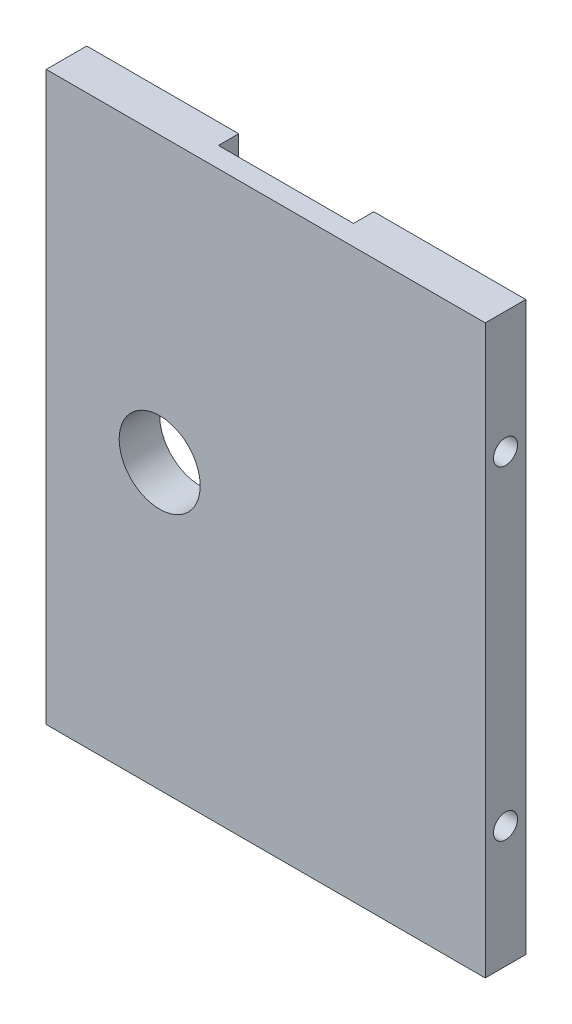
ISO-10303-21;
HEADER;
FILE_DESCRIPTION(('STEP AP214'),'2;1');
FILE_NAME('part.step','',(''),(''),'','','');
FILE_SCHEMA(('AUTOMOTIVE_DESIGN { 1 0 10303 214 1 1 1 1 }'));
ENDSEC;
DATA;
#1=APPLICATION_CONTEXT('core data for automotive mechanical design processes');
#2=APPLICATION_PROTOCOL_DEFINITION('international standard','automotive_design',2000,#1);
#3=PRODUCT_CONTEXT('',#1,'mechanical');
#4=PRODUCT('Part','Part','',(#3));
#5=PRODUCT_RELATED_PRODUCT_CATEGORY('part','',(#4));
#6=PRODUCT_DEFINITION_FORMATION('','',#4);
#7=PRODUCT_DEFINITION_CONTEXT('part definition',#1,'design');
#8=PRODUCT_DEFINITION('design','',#6,#7);
#9=PRODUCT_DEFINITION_SHAPE('','',#8);
#10=(LENGTH_UNIT() NAMED_UNIT(*) SI_UNIT(.MILLI.,.METRE.));
#11=(NAMED_UNIT(*) PLANE_ANGLE_UNIT() SI_UNIT($,.RADIAN.));
#12=(NAMED_UNIT(*) SI_UNIT($,.STERADIAN.) SOLID_ANGLE_UNIT());
#13=UNCERTAINTY_MEASURE_WITH_UNIT(LENGTH_MEASURE(1.E-05),#10,'distance_accuracy_value','');
#14=(GEOMETRIC_REPRESENTATION_CONTEXT(3) GLOBAL_UNCERTAINTY_ASSIGNED_CONTEXT((#13)) GLOBAL_UNIT_ASSIGNED_CONTEXT((#10,
#11,#12)) REPRESENTATION_CONTEXT('',''));
#15=CARTESIAN_POINT('',(0.,0.,0.));
#16=DIRECTION('',(0.,0.,1.));
#17=DIRECTION('',(1.,0.,0.));
#18=AXIS2_PLACEMENT_3D('',#15,#16,#17);
#19=CARTESIAN_POINT('',(0.,42.,3.));
#20=DIRECTION('',(0.,-1.,0.));
#21=DIRECTION('',(0.,0.,-1.));
#22=AXIS2_PLACEMENT_3D('',#19,#20,#21);
#23=PLANE('',#22);
#24=DIRECTION('',(0.,0.,-1.));
#25=VECTOR('',#24,1.);
#26=CARTESIAN_POINT('',(21.25,42.,1.5));
#27=LINE('',#26,#25);
#28=CARTESIAN_POINT('',(21.25,42.,1.5));
#29=VERTEX_POINT('',#28);
#30=CARTESIAN_POINT('',(21.25,42.,0.));
#31=VERTEX_POINT('',#30);
#32=EDGE_CURVE('E169',#29,#31,#27,.T.);
#33=ORIENTED_EDGE('',*,*,#32,.F.);
#34=DIRECTION('',(1.,0.,0.));
#35=VECTOR('',#34,1.);
#36=CARTESIAN_POINT('',(0.,42.,1.5));
#37=LINE('',#36,#35);
#38=CARTESIAN_POINT('',(11.25,42.,1.5));
#39=VERTEX_POINT('',#38);
#40=EDGE_CURVE('E148',#39,#29,#37,.T.);
#41=ORIENTED_EDGE('',*,*,#40,.F.);
#42=DIRECTION('',(0.,0.,-1.));
#43=VECTOR('',#42,1.);
#44=CARTESIAN_POINT('',(11.25,42.,1.5));
#45=LINE('',#44,#43);
#46=CARTESIAN_POINT('',(11.25,42.,0.));
#47=VERTEX_POINT('',#46);
#48=EDGE_CURVE('E173',#39,#47,#45,.T.);
#49=ORIENTED_EDGE('',*,*,#48,.T.);
#50=DIRECTION('',(-1.,0.,0.));
#51=VECTOR('',#50,1.);
#52=CARTESIAN_POINT('',(0.,42.,0.));
#53=LINE('',#52,#51);
#54=CARTESIAN_POINT('',(0.,42.,0.));
#55=VERTEX_POINT('',#54);
#56=EDGE_CURVE('E90',#47,#55,#53,.T.);
#57=ORIENTED_EDGE('',*,*,#56,.T.);
#58=DIRECTION('',(0.,0.,-1.));
#59=VECTOR('',#58,1.);
#60=CARTESIAN_POINT('',(0.,42.,3.));
#61=LINE('',#60,#59);
#62=CARTESIAN_POINT('',(0.,42.,3.));
#63=VERTEX_POINT('',#62);
#64=EDGE_CURVE('E229',#63,#55,#61,.T.);
#65=ORIENTED_EDGE('',*,*,#64,.F.);
#66=DIRECTION('',(-1.,0.,0.));
#67=VECTOR('',#66,1.);
#68=CARTESIAN_POINT('',(0.,42.,3.));
#69=LINE('',#68,#67);
#70=CARTESIAN_POINT('',(32.5,42.,3.));
#71=VERTEX_POINT('',#70);
#72=EDGE_CURVE('E69',#71,#63,#69,.T.);
#73=ORIENTED_EDGE('',*,*,#72,.F.);
#74=DIRECTION('',(0.,0.,-1.));
#75=VECTOR('',#74,1.);
#76=CARTESIAN_POINT('',(32.5,42.,3.));
#77=LINE('',#76,#75);
#78=CARTESIAN_POINT('',(32.5,42.,0.));
#79=VERTEX_POINT('',#78);
#80=EDGE_CURVE('E244',#71,#79,#77,.T.);
#81=ORIENTED_EDGE('',*,*,#80,.T.);
#82=EDGE_CURVE('E221',#79,#31,#53,.T.);
#83=ORIENTED_EDGE('',*,*,#82,.T.);
#84=EDGE_LOOP('',(#33,#41,#49,#57,#65,#73,#81,#83));
#85=FACE_BOUND('',#84,.T.);
#86=ADVANCED_FACE('F44',(#85),#23,.F.);
#87=CARTESIAN_POINT('',(0.,0.,0.));
#88=DIRECTION('',(0.,0.,-1.));
#89=DIRECTION('',(-1.,0.,0.));
#90=AXIS2_PLACEMENT_3D('',#87,#88,#89);
#91=PLANE('',#90);
#92=CARTESIAN_POINT('',(8.4,21.,0.));
#93=DIRECTION('',(0.,0.,-1.));
#94=DIRECTION('',(-1.,0.,0.));
#95=AXIS2_PLACEMENT_3D('',#92,#93,#94);
#96=CIRCLE('',#95,3.);
#97=CARTESIAN_POINT('',(5.4,21.,0.));
#98=VERTEX_POINT('',#97);
#99=EDGE_CURVE('E172',#98,#98,#96,.T.);
#100=ORIENTED_EDGE('',*,*,#99,.F.);
#101=EDGE_LOOP('',(#100));
#102=FACE_BOUND('',#101,.T.);
#103=DIRECTION('',(1.,0.,0.));
#104=VECTOR('',#103,1.);
#105=CARTESIAN_POINT('',(0.,35.5,0.));
#106=LINE('',#105,#104);
#107=CARTESIAN_POINT('',(11.25,35.5,0.));
#108=VERTEX_POINT('',#107);
#109=CARTESIAN_POINT('',(21.25,35.5,0.));
#110=VERTEX_POINT('',#109);
#111=EDGE_CURVE('E158',#108,#110,#106,.T.);
#112=ORIENTED_EDGE('',*,*,#111,.T.);
#113=DIRECTION('',(0.,1.,0.));
#114=VECTOR('',#113,1.);
#115=CARTESIAN_POINT('',(21.25,0.,0.));
#116=LINE('',#115,#114);
#117=EDGE_CURVE('E60',#110,#31,#116,.T.);
#118=ORIENTED_EDGE('',*,*,#117,.T.);
#119=ORIENTED_EDGE('',*,*,#82,.F.);
#120=DIRECTION('',(0.,1.,0.));
#121=VECTOR('',#120,1.);
#122=CARTESIAN_POINT('',(32.5,0.,0.));
#123=LINE('',#122,#121);
#124=CARTESIAN_POINT('',(32.5,0.,0.));
#125=VERTEX_POINT('',#124);
#126=EDGE_CURVE('E236',#125,#79,#123,.T.);
#127=ORIENTED_EDGE('',*,*,#126,.F.);
#128=DIRECTION('',(1.,0.,0.));
#129=VECTOR('',#128,1.);
#130=CARTESIAN_POINT('',(0.,0.,0.));
#131=LINE('',#130,#129);
#132=CARTESIAN_POINT('',(0.,0.,0.));
#133=VERTEX_POINT('',#132);
#134=EDGE_CURVE('E233',#133,#125,#131,.T.);
#135=ORIENTED_EDGE('',*,*,#134,.F.);
#136=DIRECTION('',(0.,-1.,0.));
#137=VECTOR('',#136,1.);
#138=CARTESIAN_POINT('',(0.,0.,0.));
#139=LINE('',#138,#137);
#140=EDGE_CURVE('E217',#55,#133,#139,.T.);
#141=ORIENTED_EDGE('',*,*,#140,.F.);
#142=ORIENTED_EDGE('',*,*,#56,.F.);
#143=DIRECTION('',(0.,-1.,0.));
#144=VECTOR('',#143,1.);
#145=CARTESIAN_POINT('',(11.25,0.,0.));
#146=LINE('',#145,#144);
#147=EDGE_CURVE('E154',#47,#108,#146,.T.);
#148=ORIENTED_EDGE('',*,*,#147,.T.);
#149=EDGE_LOOP('',(#112,#118,#119,#127,#135,#141,#142,#148));
#150=FACE_BOUND('',#149,.T.);
#151=ADVANCED_FACE('F256',(#102,#150),#91,.T.);
#152=CARTESIAN_POINT('',(0.,0.,3.));
#153=DIRECTION('',(1.,0.,0.));
#154=DIRECTION('',(0.,0.,-1.));
#155=AXIS2_PLACEMENT_3D('',#152,#153,#154);
#156=PLANE('',#155);
#157=CARTESIAN_POINT('',(0.,33.,1.5));
#158=DIRECTION('',(-1.,0.,0.));
#159=DIRECTION('',(0.,0.,1.));
#160=AXIS2_PLACEMENT_3D('',#157,#158,#159);
#161=CIRCLE('',#160,0.889000000000001);
#162=CARTESIAN_POINT('',(0.,33.,2.389));
#163=VERTEX_POINT('',#162);
#164=EDGE_CURVE('E201',#163,#163,#161,.T.);
#165=ORIENTED_EDGE('',*,*,#164,.F.);
#166=EDGE_LOOP('',(#165));
#167=FACE_BOUND('',#166,.T.);
#168=CARTESIAN_POINT('',(0.,9.,1.5));
#169=DIRECTION('',(-1.,0.,0.));
#170=DIRECTION('',(0.,0.,1.));
#171=AXIS2_PLACEMENT_3D('',#168,#169,#170);
#172=CIRCLE('',#171,0.888999999999999);
#173=CARTESIAN_POINT('',(0.,9.,2.389));
#174=VERTEX_POINT('',#173);
#175=EDGE_CURVE('E209',#174,#174,#172,.T.);
#176=ORIENTED_EDGE('',*,*,#175,.F.);
#177=EDGE_LOOP('',(#176));
#178=FACE_BOUND('',#177,.T.);
#179=ORIENTED_EDGE('',*,*,#140,.T.);
#180=DIRECTION('',(0.,0.,-1.));
#181=VECTOR('',#180,1.);
#182=CARTESIAN_POINT('',(0.,0.,3.));
#183=LINE('',#182,#181);
#184=CARTESIAN_POINT('',(0.,0.,3.));
#185=VERTEX_POINT('',#184);
#186=EDGE_CURVE('E11',#185,#133,#183,.T.);
#187=ORIENTED_EDGE('',*,*,#186,.F.);
#188=DIRECTION('',(0.,-1.,0.));
#189=VECTOR('',#188,1.);
#190=CARTESIAN_POINT('',(0.,0.,3.));
#191=LINE('',#190,#189);
#192=EDGE_CURVE('E218',#63,#185,#191,.T.);
#193=ORIENTED_EDGE('',*,*,#192,.F.);
#194=ORIENTED_EDGE('',*,*,#64,.T.);
#195=EDGE_LOOP('',(#179,#187,#193,#194));
#196=FACE_BOUND('',#195,.T.);
#197=ADVANCED_FACE('F46',(#167,#178,#196),#156,.F.);
#198=CARTESIAN_POINT('',(0.,0.,3.));
#199=DIRECTION('',(0.,1.,0.));
#200=DIRECTION('',(0.,0.,1.));
#201=AXIS2_PLACEMENT_3D('',#198,#199,#200);
#202=PLANE('',#201);
#203=ORIENTED_EDGE('',*,*,#134,.T.);
#204=DIRECTION('',(0.,0.,-1.));
#205=VECTOR('',#204,1.);
#206=CARTESIAN_POINT('',(32.5,0.,3.));
#207=LINE('',#206,#205);
#208=CARTESIAN_POINT('',(32.5,0.,3.));
#209=VERTEX_POINT('',#208);
#210=EDGE_CURVE('E53',#209,#125,#207,.T.);
#211=ORIENTED_EDGE('',*,*,#210,.F.);
#212=DIRECTION('',(1.,0.,0.));
#213=VECTOR('',#212,1.);
#214=CARTESIAN_POINT('',(0.,0.,3.));
#215=LINE('',#214,#213);
#216=EDGE_CURVE('E97',#185,#209,#215,.T.);
#217=ORIENTED_EDGE('',*,*,#216,.F.);
#218=ORIENTED_EDGE('',*,*,#186,.T.);
#219=EDGE_LOOP('',(#203,#211,#217,#218));
#220=FACE_BOUND('',#219,.T.);
#221=ADVANCED_FACE('F273',(#220),#202,.F.);
#222=CARTESIAN_POINT('',(32.5,0.,3.));
#223=DIRECTION('',(-1.,0.,0.));
#224=DIRECTION('',(0.,0.,1.));
#225=AXIS2_PLACEMENT_3D('',#222,#223,#224);
#226=PLANE('',#225);
#227=CARTESIAN_POINT('',(32.5,33.,1.5));
#228=DIRECTION('',(1.,0.,0.));
#229=DIRECTION('',(0.,0.,-1.));
#230=AXIS2_PLACEMENT_3D('',#227,#228,#229);
#231=CIRCLE('',#230,0.888999999999987);
#232=CARTESIAN_POINT('',(32.5,33.,0.611000000000013));
#233=VERTEX_POINT('',#232);
#234=EDGE_CURVE('E182',#233,#233,#231,.T.);
#235=ORIENTED_EDGE('',*,*,#234,.F.);
#236=EDGE_LOOP('',(#235));
#237=FACE_BOUND('',#236,.T.);
#238=CARTESIAN_POINT('',(32.5,9.,1.5));
#239=DIRECTION('',(1.,0.,0.));
#240=DIRECTION('',(0.,0.,-1.));
#241=AXIS2_PLACEMENT_3D('',#238,#239,#240);
#242=CIRCLE('',#241,0.888999999999989);
#243=CARTESIAN_POINT('',(32.5,9.,0.611000000000012));
#244=VERTEX_POINT('',#243);
#245=EDGE_CURVE('E193',#244,#244,#242,.T.);
#246=ORIENTED_EDGE('',*,*,#245,.F.);
#247=EDGE_LOOP('',(#246));
#248=FACE_BOUND('',#247,.T.);
#249=ORIENTED_EDGE('',*,*,#126,.T.);
#250=ORIENTED_EDGE('',*,*,#80,.F.);
#251=DIRECTION('',(0.,1.,0.));
#252=VECTOR('',#251,1.);
#253=CARTESIAN_POINT('',(32.5,0.,3.));
#254=LINE('',#253,#252);
#255=EDGE_CURVE('E224',#209,#71,#254,.T.);
#256=ORIENTED_EDGE('',*,*,#255,.F.);
#257=ORIENTED_EDGE('',*,*,#210,.T.);
#258=EDGE_LOOP('',(#249,#250,#256,#257));
#259=FACE_BOUND('',#258,.T.);
#260=ADVANCED_FACE('F252',(#237,#248,#259),#226,.F.);
#261=CARTESIAN_POINT('',(0.,0.,3.));
#262=DIRECTION('',(0.,0.,-1.));
#263=DIRECTION('',(-1.,0.,0.));
#264=AXIS2_PLACEMENT_3D('',#261,#262,#263);
#265=PLANE('',#264);
#266=CARTESIAN_POINT('',(8.4,21.,3.));
#267=DIRECTION('',(0.,0.,-1.));
#268=DIRECTION('',(-1.,0.,0.));
#269=AXIS2_PLACEMENT_3D('',#266,#267,#268);
#270=CIRCLE('',#269,3.);
#271=CARTESIAN_POINT('',(5.4,21.,3.));
#272=VERTEX_POINT('',#271);
#273=EDGE_CURVE('E178',#272,#272,#270,.T.);
#274=ORIENTED_EDGE('',*,*,#273,.T.);
#275=EDGE_LOOP('',(#274));
#276=FACE_BOUND('',#275,.T.);
#277=ORIENTED_EDGE('',*,*,#192,.T.);
#278=ORIENTED_EDGE('',*,*,#216,.T.);
#279=ORIENTED_EDGE('',*,*,#255,.T.);
#280=ORIENTED_EDGE('',*,*,#72,.T.);
#281=EDGE_LOOP('',(#277,#278,#279,#280));
#282=FACE_BOUND('',#281,.T.);
#283=ADVANCED_FACE('F261',(#276,#282),#265,.F.);
#284=CARTESIAN_POINT('',(5.1958349096845,9.,1.5));
#285=DIRECTION('',(-1.,0.,0.));
#286=DIRECTION('',(0.,0.,1.));
#287=AXIS2_PLACEMENT_3D('',#284,#285,#286);
#288=CONICAL_SURFACE('',#287,0.888999999999997,1.02974425867665);
#289=CARTESIAN_POINT('',(5.73,9.,1.5));
#290=VERTEX_POINT('',#289);
#291=VERTEX_LOOP('',#290);
#292=FACE_BOUND('',#291,.T.);
#293=CARTESIAN_POINT('',(5.1958349096845,9.,1.5));
#294=DIRECTION('',(-1.,0.,0.));
#295=DIRECTION('',(0.,0.,1.));
#296=AXIS2_PLACEMENT_3D('',#293,#294,#295);
#297=CIRCLE('',#296,0.888999999999997);
#298=CARTESIAN_POINT('',(5.1958349096845,9.,2.389));
#299=VERTEX_POINT('',#298);
#300=EDGE_CURVE('E213',#299,#299,#297,.T.);
#301=ORIENTED_EDGE('',*,*,#300,.T.);
#302=EDGE_LOOP('',(#301));
#303=FACE_BOUND('',#302,.T.);
#304=ADVANCED_FACE('F263',(#292,#303),#288,.F.);
#305=CARTESIAN_POINT('',(0.,9.,1.5));
#306=DIRECTION('',(-1.,0.,0.));
#307=DIRECTION('',(0.,0.,1.));
#308=AXIS2_PLACEMENT_3D('',#305,#306,#307);
#309=CYLINDRICAL_SURFACE('',#308,0.888999999999998);
#310=ORIENTED_EDGE('',*,*,#300,.F.);
#311=EDGE_LOOP('',(#310));
#312=FACE_BOUND('',#311,.T.);
#313=ORIENTED_EDGE('',*,*,#175,.T.);
#314=EDGE_LOOP('',(#313));
#315=FACE_BOUND('',#314,.T.);
#316=ADVANCED_FACE('F270',(#312,#315),#309,.F.);
#317=CARTESIAN_POINT('',(5.1958349096845,33.,1.5));
#318=DIRECTION('',(-1.,0.,0.));
#319=DIRECTION('',(0.,0.,1.));
#320=AXIS2_PLACEMENT_3D('',#317,#318,#319);
#321=CONICAL_SURFACE('',#320,0.889000000000001,1.02974425867665);
#322=CARTESIAN_POINT('',(5.73,33.,1.5));
#323=VERTEX_POINT('',#322);
#324=VERTEX_LOOP('',#323);
#325=FACE_BOUND('',#324,.T.);
#326=CARTESIAN_POINT('',(5.1958349096845,33.,1.5));
#327=DIRECTION('',(-1.,0.,0.));
#328=DIRECTION('',(0.,0.,1.));
#329=AXIS2_PLACEMENT_3D('',#326,#327,#328);
#330=CIRCLE('',#329,0.889000000000001);
#331=CARTESIAN_POINT('',(5.1958349096845,33.,2.389));
#332=VERTEX_POINT('',#331);
#333=EDGE_CURVE('E205',#332,#332,#330,.T.);
#334=ORIENTED_EDGE('',*,*,#333,.T.);
#335=EDGE_LOOP('',(#334));
#336=FACE_BOUND('',#335,.T.);
#337=ADVANCED_FACE('F325',(#325,#336),#321,.F.);
#338=CARTESIAN_POINT('',(0.,33.,1.5));
#339=DIRECTION('',(-1.,0.,0.));
#340=DIRECTION('',(0.,0.,1.));
#341=AXIS2_PLACEMENT_3D('',#338,#339,#340);
#342=CYLINDRICAL_SURFACE('',#341,0.889000000000001);
#343=ORIENTED_EDGE('',*,*,#333,.F.);
#344=EDGE_LOOP('',(#343));
#345=FACE_BOUND('',#344,.T.);
#346=ORIENTED_EDGE('',*,*,#164,.T.);
#347=EDGE_LOOP('',(#346));
#348=FACE_BOUND('',#347,.T.);
#349=ADVANCED_FACE('F321',(#345,#348),#342,.F.);
#350=CARTESIAN_POINT('',(27.3041650903155,9.,1.5));
#351=DIRECTION('',(1.,0.,0.));
#352=DIRECTION('',(0.,0.,-1.));
#353=AXIS2_PLACEMENT_3D('',#350,#351,#352);
#354=CONICAL_SURFACE('',#353,0.888999999999999,1.02974425867665);
#355=CARTESIAN_POINT('',(26.77,9.,1.5));
#356=VERTEX_POINT('',#355);
#357=VERTEX_LOOP('',#356);
#358=FACE_BOUND('',#357,.T.);
#359=CARTESIAN_POINT('',(27.3041650903155,9.,1.5));
#360=DIRECTION('',(1.,0.,0.));
#361=DIRECTION('',(0.,0.,-1.));
#362=AXIS2_PLACEMENT_3D('',#359,#360,#361);
#363=CIRCLE('',#362,0.888999999999999);
#364=CARTESIAN_POINT('',(27.3041650903155,9.,0.611000000000001));
#365=VERTEX_POINT('',#364);
#366=EDGE_CURVE('E197',#365,#365,#363,.T.);
#367=ORIENTED_EDGE('',*,*,#366,.T.);
#368=EDGE_LOOP('',(#367));
#369=FACE_BOUND('',#368,.T.);
#370=ADVANCED_FACE('F317',(#358,#369),#354,.F.);
#371=CARTESIAN_POINT('',(32.5,9.,1.5));
#372=DIRECTION('',(1.,0.,0.));
#373=DIRECTION('',(0.,0.,-1.));
#374=AXIS2_PLACEMENT_3D('',#371,#372,#373);
#375=CYLINDRICAL_SURFACE('',#374,0.888999999999994);
#376=ORIENTED_EDGE('',*,*,#366,.F.);
#377=EDGE_LOOP('',(#376));
#378=FACE_BOUND('',#377,.T.);
#379=ORIENTED_EDGE('',*,*,#245,.T.);
#380=EDGE_LOOP('',(#379));
#381=FACE_BOUND('',#380,.T.);
#382=ADVANCED_FACE('F313',(#378,#381),#375,.F.);
#383=CARTESIAN_POINT('',(27.3041650903155,33.,1.5));
#384=DIRECTION('',(1.,0.,0.));
#385=DIRECTION('',(0.,0.,-1.));
#386=AXIS2_PLACEMENT_3D('',#383,#384,#385);
#387=CONICAL_SURFACE('',#386,0.889000000000001,1.02974425867665);
#388=CARTESIAN_POINT('',(26.77,33.,1.5));
#389=VERTEX_POINT('',#388);
#390=VERTEX_LOOP('',#389);
#391=FACE_BOUND('',#390,.T.);
#392=CARTESIAN_POINT('',(27.3041650903155,33.,1.5));
#393=DIRECTION('',(1.,0.,0.));
#394=DIRECTION('',(0.,0.,-1.));
#395=AXIS2_PLACEMENT_3D('',#392,#393,#394);
#396=CIRCLE('',#395,0.889000000000001);
#397=CARTESIAN_POINT('',(27.3041650903155,33.,0.610999999999999));
#398=VERTEX_POINT('',#397);
#399=EDGE_CURVE('E189',#398,#398,#396,.T.);
#400=ORIENTED_EDGE('',*,*,#399,.T.);
#401=EDGE_LOOP('',(#400));
#402=FACE_BOUND('',#401,.T.);
#403=ADVANCED_FACE('F309',(#391,#402),#387,.F.);
#404=CARTESIAN_POINT('',(32.5,33.,1.5));
#405=DIRECTION('',(1.,0.,0.));
#406=DIRECTION('',(0.,0.,-1.));
#407=AXIS2_PLACEMENT_3D('',#404,#405,#406);
#408=CYLINDRICAL_SURFACE('',#407,0.888999999999994);
#409=ORIENTED_EDGE('',*,*,#399,.F.);
#410=EDGE_LOOP('',(#409));
#411=FACE_BOUND('',#410,.T.);
#412=ORIENTED_EDGE('',*,*,#234,.T.);
#413=EDGE_LOOP('',(#412));
#414=FACE_BOUND('',#413,.T.);
#415=ADVANCED_FACE('F305',(#411,#414),#408,.F.);
#416=CARTESIAN_POINT('',(8.4,21.,3.));
#417=DIRECTION('',(0.,0.,-1.));
#418=DIRECTION('',(-1.,0.,0.));
#419=AXIS2_PLACEMENT_3D('',#416,#417,#418);
#420=CYLINDRICAL_SURFACE('',#419,3.);
#421=ORIENTED_EDGE('',*,*,#273,.F.);
#422=EDGE_LOOP('',(#421));
#423=FACE_BOUND('',#422,.T.);
#424=ORIENTED_EDGE('',*,*,#99,.T.);
#425=EDGE_LOOP('',(#424));
#426=FACE_BOUND('',#425,.T.);
#427=ADVANCED_FACE('F299',(#423,#426),#420,.F.);
#428=CARTESIAN_POINT('',(21.25,0.,1.5));
#429=DIRECTION('',(-1.,0.,0.));
#430=DIRECTION('',(0.,0.,1.));
#431=AXIS2_PLACEMENT_3D('',#428,#429,#430);
#432=PLANE('',#431);
#433=ORIENTED_EDGE('',*,*,#117,.F.);
#434=DIRECTION('',(0.,0.,-1.));
#435=VECTOR('',#434,1.);
#436=CARTESIAN_POINT('',(21.25,35.5,1.5));
#437=LINE('',#436,#435);
#438=CARTESIAN_POINT('',(21.25,35.5,1.5));
#439=VERTEX_POINT('',#438);
#440=EDGE_CURVE('E135',#439,#110,#437,.T.);
#441=ORIENTED_EDGE('',*,*,#440,.F.);
#442=DIRECTION('',(0.,1.,0.));
#443=VECTOR('',#442,1.);
#444=CARTESIAN_POINT('',(21.25,0.,1.5));
#445=LINE('',#444,#443);
#446=EDGE_CURVE('E143',#439,#29,#445,.T.);
#447=ORIENTED_EDGE('',*,*,#446,.T.);
#448=ORIENTED_EDGE('',*,*,#32,.T.);
#449=EDGE_LOOP('',(#433,#441,#447,#448));
#450=FACE_BOUND('',#449,.T.);
#451=ADVANCED_FACE('F145',(#450),#432,.T.);
#452=CARTESIAN_POINT('',(11.25,0.,1.5));
#453=DIRECTION('',(1.,0.,0.));
#454=DIRECTION('',(0.,0.,-1.));
#455=AXIS2_PLACEMENT_3D('',#452,#453,#454);
#456=PLANE('',#455);
#457=ORIENTED_EDGE('',*,*,#147,.F.);
#458=ORIENTED_EDGE('',*,*,#48,.F.);
#459=DIRECTION('',(0.,-1.,0.));
#460=VECTOR('',#459,1.);
#461=CARTESIAN_POINT('',(11.25,0.,1.5));
#462=LINE('',#461,#460);
#463=CARTESIAN_POINT('',(11.25,35.5,1.5));
#464=VERTEX_POINT('',#463);
#465=EDGE_CURVE('E142',#39,#464,#462,.T.);
#466=ORIENTED_EDGE('',*,*,#465,.T.);
#467=DIRECTION('',(0.,0.,-1.));
#468=VECTOR('',#467,1.);
#469=CARTESIAN_POINT('',(11.25,35.5,1.5));
#470=LINE('',#469,#468);
#471=EDGE_CURVE('E137',#464,#108,#470,.T.);
#472=ORIENTED_EDGE('',*,*,#471,.T.);
#473=EDGE_LOOP('',(#457,#458,#466,#472));
#474=FACE_BOUND('',#473,.T.);
#475=ADVANCED_FACE('F291',(#474),#456,.T.);
#476=CARTESIAN_POINT('',(0.,35.5,1.5));
#477=DIRECTION('',(0.,1.,0.));
#478=DIRECTION('',(0.,0.,1.));
#479=AXIS2_PLACEMENT_3D('',#476,#477,#478);
#480=PLANE('',#479);
#481=ORIENTED_EDGE('',*,*,#111,.F.);
#482=ORIENTED_EDGE('',*,*,#471,.F.);
#483=DIRECTION('',(1.,0.,0.));
#484=VECTOR('',#483,1.);
#485=CARTESIAN_POINT('',(0.,35.5,1.5));
#486=LINE('',#485,#484);
#487=EDGE_CURVE('E132',#464,#439,#486,.T.);
#488=ORIENTED_EDGE('',*,*,#487,.T.);
#489=ORIENTED_EDGE('',*,*,#440,.T.);
#490=EDGE_LOOP('',(#481,#482,#488,#489));
#491=FACE_BOUND('',#490,.T.);
#492=ADVANCED_FACE('F134',(#491),#480,.T.);
#493=CARTESIAN_POINT('',(0.,0.,1.5));
#494=DIRECTION('',(0.,0.,-1.));
#495=DIRECTION('',(-1.,0.,0.));
#496=AXIS2_PLACEMENT_3D('',#493,#494,#495);
#497=PLANE('',#496);
#498=ORIENTED_EDGE('',*,*,#446,.F.);
#499=ORIENTED_EDGE('',*,*,#487,.F.);
#500=ORIENTED_EDGE('',*,*,#465,.F.);
#501=ORIENTED_EDGE('',*,*,#40,.T.);
#502=EDGE_LOOP('',(#498,#499,#500,#501));
#503=FACE_BOUND('',#502,.T.);
#504=ADVANCED_FACE('F150',(#503),#497,.T.);
#505=CLOSED_SHELL('',(#86,#151,#197,#221,#260,#283,#304,#316,#337,#349,#370,#382,#403,#415,#427,
#451,#475,#492,#504));
#506=MANIFOLD_SOLID_BREP('B2',#505);
#507=ADVANCED_BREP_SHAPE_REPRESENTATION('',(#18,#506),#14);
#508=SHAPE_DEFINITION_REPRESENTATION(#9,#507);
ENDSEC;
END-ISO-10303-21;
